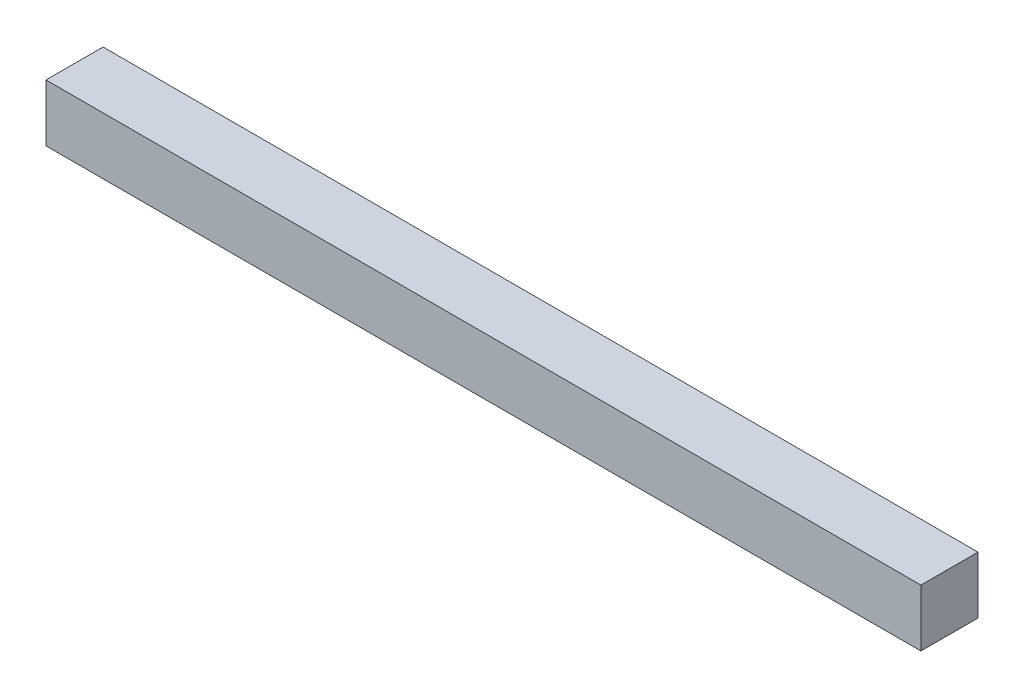
ISO-10303-21;
HEADER;
FILE_DESCRIPTION(('STEP AP214'),'2;1');
FILE_NAME('part.step','',(''),(''),'','','');
FILE_SCHEMA(('AUTOMOTIVE_DESIGN { 1 0 10303 214 1 1 1 1 }'));
ENDSEC;
DATA;
#1=APPLICATION_CONTEXT('core data for automotive mechanical design processes');
#2=APPLICATION_PROTOCOL_DEFINITION('international standard','automotive_design',2000,#1);
#3=PRODUCT_CONTEXT('',#1,'mechanical');
#4=PRODUCT('Part','Part','',(#3));
#5=PRODUCT_RELATED_PRODUCT_CATEGORY('part','',(#4));
#6=PRODUCT_DEFINITION_FORMATION('','',#4);
#7=PRODUCT_DEFINITION_CONTEXT('part definition',#1,'design');
#8=PRODUCT_DEFINITION('design','',#6,#7);
#9=PRODUCT_DEFINITION_SHAPE('','',#8);
#10=(LENGTH_UNIT() NAMED_UNIT(*) SI_UNIT(.MILLI.,.METRE.));
#11=(NAMED_UNIT(*) PLANE_ANGLE_UNIT() SI_UNIT($,.RADIAN.));
#12=(NAMED_UNIT(*) SI_UNIT($,.STERADIAN.) SOLID_ANGLE_UNIT());
#13=UNCERTAINTY_MEASURE_WITH_UNIT(LENGTH_MEASURE(1.E-05),#10,'distance_accuracy_value','');
#14=(GEOMETRIC_REPRESENTATION_CONTEXT(3) GLOBAL_UNCERTAINTY_ASSIGNED_CONTEXT((#13)) GLOBAL_UNIT_ASSIGNED_CONTEXT((#10,
#11,#12)) REPRESENTATION_CONTEXT('',''));
#15=CARTESIAN_POINT('',(0.,0.,0.));
#16=DIRECTION('',(0.,0.,1.));
#17=DIRECTION('',(1.,0.,0.));
#18=AXIS2_PLACEMENT_3D('',#15,#16,#17);
#19=CARTESIAN_POINT('',(229.89794,0.,0.));
#20=DIRECTION('',(0.,0.,-1.));
#21=DIRECTION('',(-1.,0.,0.));
#22=AXIS2_PLACEMENT_3D('',#19,#20,#21);
#23=PLANE('',#22);
#24=DIRECTION('',(0.,-1.,0.));
#25=VECTOR('',#24,1.);
#26=CARTESIAN_POINT('',(0.,0.,0.));
#27=LINE('',#26,#25);
#28=CARTESIAN_POINT('',(0.,14.99997,0.));
#29=VERTEX_POINT('',#28);
#30=CARTESIAN_POINT('',(0.,0.,0.));
#31=VERTEX_POINT('',#30);
#32=EDGE_CURVE('E96',#29,#31,#27,.T.);
#33=ORIENTED_EDGE('',*,*,#32,.T.);
#34=DIRECTION('',(-1.,0.,0.));
#35=VECTOR('',#34,1.);
#36=CARTESIAN_POINT('',(229.89794,0.,0.));
#37=LINE('',#36,#35);
#38=CARTESIAN_POINT('',(229.89794,0.,0.));
#39=VERTEX_POINT('',#38);
#40=EDGE_CURVE('E11',#39,#31,#37,.T.);
#41=ORIENTED_EDGE('',*,*,#40,.F.);
#42=DIRECTION('',(0.,-1.,0.));
#43=VECTOR('',#42,1.);
#44=CARTESIAN_POINT('',(229.89794,0.,0.));
#45=LINE('',#44,#43);
#46=CARTESIAN_POINT('',(229.89794,14.99997,0.));
#47=VERTEX_POINT('',#46);
#48=EDGE_CURVE('E84',#47,#39,#45,.T.);
#49=ORIENTED_EDGE('',*,*,#48,.F.);
#50=DIRECTION('',(-1.,0.,0.));
#51=VECTOR('',#50,1.);
#52=CARTESIAN_POINT('',(229.89794,14.99997,0.));
#53=LINE('',#52,#51);
#54=EDGE_CURVE('E92',#47,#29,#53,.T.);
#55=ORIENTED_EDGE('',*,*,#54,.T.);
#56=EDGE_LOOP('',(#33,#41,#49,#55));
#57=FACE_BOUND('',#56,.T.);
#58=ADVANCED_FACE('F33',(#57),#23,.F.);
#59=CARTESIAN_POINT('',(229.89794,0.,0.));
#60=DIRECTION('',(0.,1.,0.));
#61=DIRECTION('',(0.,0.,1.));
#62=AXIS2_PLACEMENT_3D('',#59,#60,#61);
#63=PLANE('',#62);
#64=DIRECTION('',(0.,0.,-1.));
#65=VECTOR('',#64,1.);
#66=CARTESIAN_POINT('',(0.,0.,0.));
#67=LINE('',#66,#65);
#68=CARTESIAN_POINT('',(0.,0.,-14.99997));
#69=VERTEX_POINT('',#68);
#70=EDGE_CURVE('E88',#31,#69,#67,.T.);
#71=ORIENTED_EDGE('',*,*,#70,.T.);
#72=DIRECTION('',(-1.,0.,0.));
#73=VECTOR('',#72,1.);
#74=CARTESIAN_POINT('',(229.89794,0.,-14.99997));
#75=LINE('',#74,#73);
#76=CARTESIAN_POINT('',(229.89794,0.,-14.99997));
#77=VERTEX_POINT('',#76);
#78=EDGE_CURVE('E41',#77,#69,#75,.T.);
#79=ORIENTED_EDGE('',*,*,#78,.F.);
#80=DIRECTION('',(0.,0.,-1.));
#81=VECTOR('',#80,1.);
#82=CARTESIAN_POINT('',(229.89794,0.,0.));
#83=LINE('',#82,#81);
#84=EDGE_CURVE('E79',#39,#77,#83,.T.);
#85=ORIENTED_EDGE('',*,*,#84,.F.);
#86=ORIENTED_EDGE('',*,*,#40,.T.);
#87=EDGE_LOOP('',(#71,#79,#85,#86));
#88=FACE_BOUND('',#87,.T.);
#89=ADVANCED_FACE('F87',(#88),#63,.F.);
#90=CARTESIAN_POINT('',(229.89794,0.,-14.99997));
#91=DIRECTION('',(0.,0.,1.));
#92=DIRECTION('',(1.,0.,0.));
#93=AXIS2_PLACEMENT_3D('',#90,#91,#92);
#94=PLANE('',#93);
#95=DIRECTION('',(0.,1.,0.));
#96=VECTOR('',#95,1.);
#97=CARTESIAN_POINT('',(0.,0.,-14.99997));
#98=LINE('',#97,#96);
#99=CARTESIAN_POINT('',(0.,14.99997,-14.99997));
#100=VERTEX_POINT('',#99);
#101=EDGE_CURVE('E66',#69,#100,#98,.T.);
#102=ORIENTED_EDGE('',*,*,#101,.T.);
#103=DIRECTION('',(-1.,0.,0.));
#104=VECTOR('',#103,1.);
#105=CARTESIAN_POINT('',(229.89794,14.99997,-14.99997));
#106=LINE('',#105,#104);
#107=CARTESIAN_POINT('',(229.89794,14.99997,-14.99997));
#108=VERTEX_POINT('',#107);
#109=EDGE_CURVE('E89',#108,#100,#106,.T.);
#110=ORIENTED_EDGE('',*,*,#109,.F.);
#111=DIRECTION('',(0.,1.,0.));
#112=VECTOR('',#111,1.);
#113=CARTESIAN_POINT('',(229.89794,0.,-14.99997));
#114=LINE('',#113,#112);
#115=EDGE_CURVE('E82',#77,#108,#114,.T.);
#116=ORIENTED_EDGE('',*,*,#115,.F.);
#117=ORIENTED_EDGE('',*,*,#78,.T.);
#118=EDGE_LOOP('',(#102,#110,#116,#117));
#119=FACE_BOUND('',#118,.T.);
#120=ADVANCED_FACE('F90',(#119),#94,.F.);
#121=CARTESIAN_POINT('',(229.89794,14.99997,0.));
#122=DIRECTION('',(0.,-1.,0.));
#123=DIRECTION('',(0.,0.,-1.));
#124=AXIS2_PLACEMENT_3D('',#121,#122,#123);
#125=PLANE('',#124);
#126=DIRECTION('',(0.,0.,1.));
#127=VECTOR('',#126,1.);
#128=CARTESIAN_POINT('',(0.,14.99997,0.));
#129=LINE('',#128,#127);
#130=EDGE_CURVE('E72',#100,#29,#129,.T.);
#131=ORIENTED_EDGE('',*,*,#130,.T.);
#132=ORIENTED_EDGE('',*,*,#54,.F.);
#133=DIRECTION('',(0.,0.,1.));
#134=VECTOR('',#133,1.);
#135=CARTESIAN_POINT('',(229.89794,14.99997,0.));
#136=LINE('',#135,#134);
#137=EDGE_CURVE('E49',#108,#47,#136,.T.);
#138=ORIENTED_EDGE('',*,*,#137,.F.);
#139=ORIENTED_EDGE('',*,*,#109,.T.);
#140=EDGE_LOOP('',(#131,#132,#138,#139));
#141=FACE_BOUND('',#140,.T.);
#142=ADVANCED_FACE('F103',(#141),#125,.F.);
#143=CARTESIAN_POINT('',(229.89794,0.,0.));
#144=DIRECTION('',(-1.,0.,0.));
#145=DIRECTION('',(0.,0.,1.));
#146=AXIS2_PLACEMENT_3D('',#143,#144,#145);
#147=PLANE('',#146);
#148=ORIENTED_EDGE('',*,*,#48,.T.);
#149=ORIENTED_EDGE('',*,*,#84,.T.);
#150=ORIENTED_EDGE('',*,*,#115,.T.);
#151=ORIENTED_EDGE('',*,*,#137,.T.);
#152=EDGE_LOOP('',(#148,#149,#150,#151));
#153=FACE_BOUND('',#152,.T.);
#154=ADVANCED_FACE('F80',(#153),#147,.F.);
#155=CARTESIAN_POINT('',(0.,0.,0.));
#156=DIRECTION('',(-1.,0.,0.));
#157=DIRECTION('',(0.,0.,1.));
#158=AXIS2_PLACEMENT_3D('',#155,#156,#157);
#159=PLANE('',#158);
#160=ORIENTED_EDGE('',*,*,#32,.F.);
#161=ORIENTED_EDGE('',*,*,#130,.F.);
#162=ORIENTED_EDGE('',*,*,#101,.F.);
#163=ORIENTED_EDGE('',*,*,#70,.F.);
#164=EDGE_LOOP('',(#160,#161,#162,#163));
#165=FACE_BOUND('',#164,.T.);
#166=ADVANCED_FACE('F106',(#165),#159,.T.);
#167=CLOSED_SHELL('',(#58,#89,#120,#142,#154,#166));
#168=MANIFOLD_SOLID_BREP('B2',#167);
#169=ADVANCED_BREP_SHAPE_REPRESENTATION('',(#18,#168),#14);
#170=SHAPE_DEFINITION_REPRESENTATION(#9,#169);
ENDSEC;
END-ISO-10303-21;
